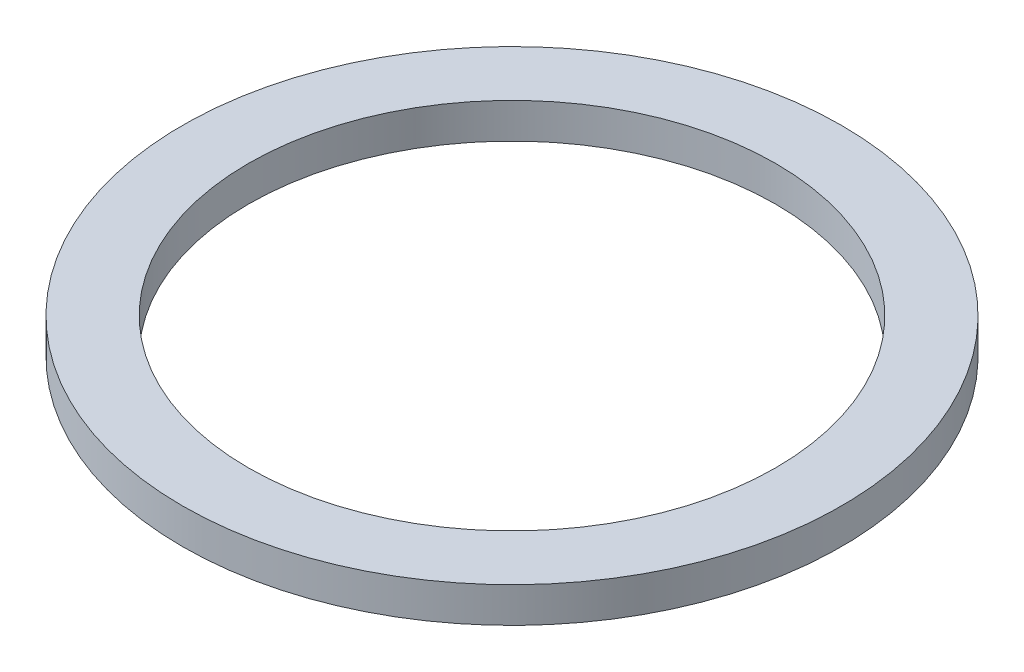
ISO-10303-21;
HEADER;
FILE_DESCRIPTION(('STEP AP214'),'2;1');
FILE_NAME('part.step','',(''),(''),'','','');
FILE_SCHEMA(('AUTOMOTIVE_DESIGN { 1 0 10303 214 1 1 1 1 }'));
ENDSEC;
DATA;
#1=APPLICATION_CONTEXT('core data for automotive mechanical design processes');
#2=APPLICATION_PROTOCOL_DEFINITION('international standard','automotive_design',2000,#1);
#3=PRODUCT_CONTEXT('',#1,'mechanical');
#4=PRODUCT('Part','Part','',(#3));
#5=PRODUCT_RELATED_PRODUCT_CATEGORY('part','',(#4));
#6=PRODUCT_DEFINITION_FORMATION('','',#4);
#7=PRODUCT_DEFINITION_CONTEXT('part definition',#1,'design');
#8=PRODUCT_DEFINITION('design','',#6,#7);
#9=PRODUCT_DEFINITION_SHAPE('','',#8);
#10=(LENGTH_UNIT() NAMED_UNIT(*) SI_UNIT(.MILLI.,.METRE.));
#11=(NAMED_UNIT(*) PLANE_ANGLE_UNIT() SI_UNIT($,.RADIAN.));
#12=(NAMED_UNIT(*) SI_UNIT($,.STERADIAN.) SOLID_ANGLE_UNIT());
#13=UNCERTAINTY_MEASURE_WITH_UNIT(LENGTH_MEASURE(1.E-05),#10,'distance_accuracy_value','');
#14=(GEOMETRIC_REPRESENTATION_CONTEXT(3) GLOBAL_UNCERTAINTY_ASSIGNED_CONTEXT((#13)) GLOBAL_UNIT_ASSIGNED_CONTEXT((#10,
#11,#12)) REPRESENTATION_CONTEXT('',''));
#15=CARTESIAN_POINT('',(0.,0.,0.));
#16=DIRECTION('',(0.,0.,1.));
#17=DIRECTION('',(1.,0.,0.));
#18=AXIS2_PLACEMENT_3D('',#15,#16,#17);
#19=CARTESIAN_POINT('',(0.,5.3522,0.));
#20=DIRECTION('',(0.,1.,0.));
#21=DIRECTION('',(0.,0.,1.));
#22=AXIS2_PLACEMENT_3D('',#19,#20,#21);
#23=PLANE('',#22);
#24=CARTESIAN_POINT('',(0.,5.3522,0.));
#25=DIRECTION('',(0.,1.,0.));
#26=DIRECTION('',(0.,0.,1.));
#27=AXIS2_PLACEMENT_3D('',#24,#25,#26);
#28=CIRCLE('',#27,50.);
#29=CARTESIAN_POINT('',(0.,5.3522,50.));
#30=VERTEX_POINT('',#29);
#31=EDGE_CURVE('E10',#30,#30,#28,.T.);
#32=ORIENTED_EDGE('',*,*,#31,.T.);
#33=EDGE_LOOP('',(#32));
#34=FACE_BOUND('',#33,.T.);
#35=CARTESIAN_POINT('',(0.,5.3522,0.));
#36=DIRECTION('',(0.,1.,0.));
#37=DIRECTION('',(0.,0.,1.));
#38=AXIS2_PLACEMENT_3D('',#35,#36,#37);
#39=CIRCLE('',#38,40.);
#40=CARTESIAN_POINT('',(0.,5.3522,40.));
#41=VERTEX_POINT('',#40);
#42=EDGE_CURVE('E42',#41,#41,#39,.T.);
#43=ORIENTED_EDGE('',*,*,#42,.F.);
#44=EDGE_LOOP('',(#43));
#45=FACE_BOUND('',#44,.T.);
#46=ADVANCED_FACE('F31',(#34,#45),#23,.T.);
#47=CARTESIAN_POINT('',(0.,0.,0.));
#48=DIRECTION('',(0.,1.,0.));
#49=DIRECTION('',(0.,0.,1.));
#50=AXIS2_PLACEMENT_3D('',#47,#48,#49);
#51=PLANE('',#50);
#52=CARTESIAN_POINT('',(0.,0.,0.));
#53=DIRECTION('',(0.,1.,0.));
#54=DIRECTION('',(0.,0.,1.));
#55=AXIS2_PLACEMENT_3D('',#52,#53,#54);
#56=CIRCLE('',#55,50.);
#57=CARTESIAN_POINT('',(0.,0.,50.));
#58=VERTEX_POINT('',#57);
#59=EDGE_CURVE('E35',#58,#58,#56,.T.);
#60=ORIENTED_EDGE('',*,*,#59,.F.);
#61=EDGE_LOOP('',(#60));
#62=FACE_BOUND('',#61,.T.);
#63=CARTESIAN_POINT('',(0.,0.,0.));
#64=DIRECTION('',(0.,1.,0.));
#65=DIRECTION('',(0.,0.,1.));
#66=AXIS2_PLACEMENT_3D('',#63,#64,#65);
#67=CIRCLE('',#66,40.);
#68=CARTESIAN_POINT('',(0.,0.,40.));
#69=VERTEX_POINT('',#68);
#70=EDGE_CURVE('E44',#69,#69,#67,.T.);
#71=ORIENTED_EDGE('',*,*,#70,.T.);
#72=EDGE_LOOP('',(#71));
#73=FACE_BOUND('',#72,.T.);
#74=ADVANCED_FACE('F54',(#62,#73),#51,.F.);
#75=CARTESIAN_POINT('',(0.,5.3522,0.));
#76=DIRECTION('',(0.,-1.,0.));
#77=DIRECTION('',(0.,0.,-1.));
#78=AXIS2_PLACEMENT_3D('',#75,#76,#77);
#79=CYLINDRICAL_SURFACE('',#78,50.);
#80=ORIENTED_EDGE('',*,*,#31,.F.);
#81=EDGE_LOOP('',(#80));
#82=FACE_BOUND('',#81,.T.);
#83=ORIENTED_EDGE('',*,*,#59,.T.);
#84=EDGE_LOOP('',(#83));
#85=FACE_BOUND('',#84,.T.);
#86=ADVANCED_FACE('F33',(#82,#85),#79,.T.);
#87=CARTESIAN_POINT('',(0.,5.3522,0.));
#88=DIRECTION('',(0.,-1.,0.));
#89=DIRECTION('',(0.,0.,-1.));
#90=AXIS2_PLACEMENT_3D('',#87,#88,#89);
#91=CYLINDRICAL_SURFACE('',#90,40.);
#92=ORIENTED_EDGE('',*,*,#42,.T.);
#93=EDGE_LOOP('',(#92));
#94=FACE_BOUND('',#93,.T.);
#95=ORIENTED_EDGE('',*,*,#70,.F.);
#96=EDGE_LOOP('',(#95));
#97=FACE_BOUND('',#96,.T.);
#98=ADVANCED_FACE('F50',(#94,#97),#91,.F.);
#99=CLOSED_SHELL('',(#46,#74,#86,#98));
#100=MANIFOLD_SOLID_BREP('B2',#99);
#101=ADVANCED_BREP_SHAPE_REPRESENTATION('',(#18,#100),#14);
#102=SHAPE_DEFINITION_REPRESENTATION(#9,#101);
ENDSEC;
END-ISO-10303-21;
